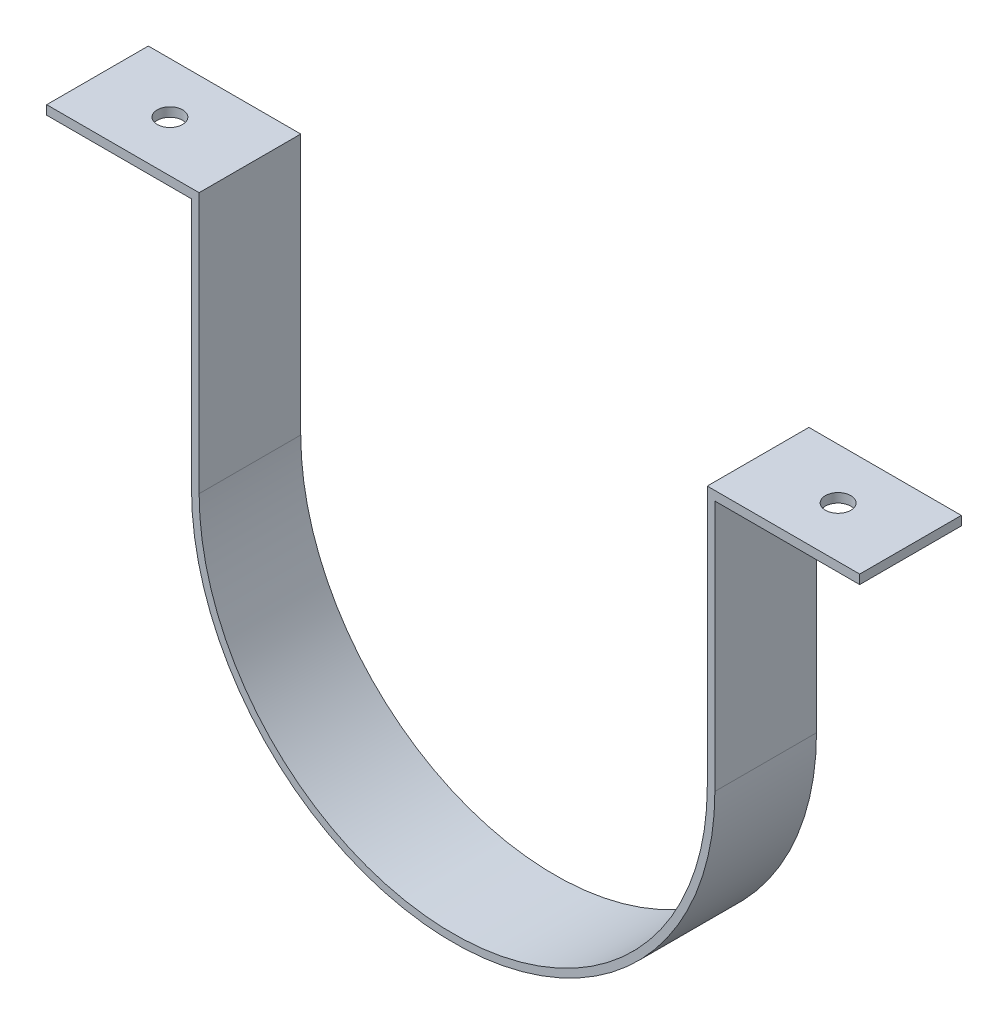
ISO-10303-21;
HEADER;
FILE_DESCRIPTION(('STEP AP214'),'2;1');
FILE_NAME('part.step','',(''),(''),'','','');
FILE_SCHEMA(('AUTOMOTIVE_DESIGN { 1 0 10303 214 1 1 1 1 }'));
ENDSEC;
DATA;
#1=APPLICATION_CONTEXT('core data for automotive mechanical design processes');
#2=APPLICATION_PROTOCOL_DEFINITION('international standard','automotive_design',2000,#1);
#3=PRODUCT_CONTEXT('',#1,'mechanical');
#4=PRODUCT('Part','Part','',(#3));
#5=PRODUCT_RELATED_PRODUCT_CATEGORY('part','',(#4));
#6=PRODUCT_DEFINITION_FORMATION('','',#4);
#7=PRODUCT_DEFINITION_CONTEXT('part definition',#1,'design');
#8=PRODUCT_DEFINITION('design','',#6,#7);
#9=PRODUCT_DEFINITION_SHAPE('','',#8);
#10=(LENGTH_UNIT() NAMED_UNIT(*) SI_UNIT(.MILLI.,.METRE.));
#11=(NAMED_UNIT(*) PLANE_ANGLE_UNIT() SI_UNIT($,.RADIAN.));
#12=(NAMED_UNIT(*) SI_UNIT($,.STERADIAN.) SOLID_ANGLE_UNIT());
#13=UNCERTAINTY_MEASURE_WITH_UNIT(LENGTH_MEASURE(1.E-05),#10,'distance_accuracy_value','');
#14=(GEOMETRIC_REPRESENTATION_CONTEXT(3) GLOBAL_UNCERTAINTY_ASSIGNED_CONTEXT((#13)) GLOBAL_UNIT_ASSIGNED_CONTEXT((#10,
#11,#12)) REPRESENTATION_CONTEXT('',''));
#15=CARTESIAN_POINT('',(0.,0.,0.));
#16=DIRECTION('',(0.,0.,1.));
#17=DIRECTION('',(1.,0.,0.));
#18=AXIS2_PLACEMENT_3D('',#15,#16,#17);
#19=CARTESIAN_POINT('',(91.5283724131082,0.,2.));
#20=DIRECTION('',(-1.,0.,0.));
#21=DIRECTION('',(0.,0.,1.));
#22=AXIS2_PLACEMENT_3D('',#19,#20,#21);
#23=PLANE('',#22);
#24=DIRECTION('',(0.,1.,0.));
#25=VECTOR('',#24,1.);
#26=CARTESIAN_POINT('',(91.5283724131082,0.,0.));
#27=LINE('',#26,#25);
#28=CARTESIAN_POINT('',(91.5283724131082,-7.72076374787895,0.));
#29=VERTEX_POINT('',#28);
#30=CARTESIAN_POINT('',(91.5283724131082,-2.77076374787895,0.));
#31=VERTEX_POINT('',#30);
#32=EDGE_CURVE('E154',#29,#31,#27,.T.);
#33=ORIENTED_EDGE('',*,*,#32,.F.);
#34=DIRECTION('',(0.,0.,-1.));
#35=VECTOR('',#34,1.);
#36=CARTESIAN_POINT('',(91.5283724131082,-7.72076374787895,2.));
#37=LINE('',#36,#35);
#38=CARTESIAN_POINT('',(91.5283724131082,-7.72076374787895,2.));
#39=VERTEX_POINT('',#38);
#40=EDGE_CURVE('E11',#39,#29,#37,.T.);
#41=ORIENTED_EDGE('',*,*,#40,.F.);
#42=DIRECTION('',(0.,1.,0.));
#43=VECTOR('',#42,1.);
#44=CARTESIAN_POINT('',(91.5283724131082,0.,2.));
#45=LINE('',#44,#43);
#46=CARTESIAN_POINT('',(91.5283724131082,-2.77076374787895,2.));
#47=VERTEX_POINT('',#46);
#48=EDGE_CURVE('E183',#39,#47,#45,.T.);
#49=ORIENTED_EDGE('',*,*,#48,.T.);
#50=DIRECTION('',(0.,0.,-1.));
#51=VECTOR('',#50,1.);
#52=CARTESIAN_POINT('',(91.5283724131082,-2.77076374787895,2.));
#53=LINE('',#52,#51);
#54=EDGE_CURVE('E52',#47,#31,#53,.T.);
#55=ORIENTED_EDGE('',*,*,#54,.T.);
#56=EDGE_LOOP('',(#33,#41,#49,#55));
#57=FACE_BOUND('',#56,.T.);
#58=ADVANCED_FACE('F35',(#57),#23,.T.);
#59=CARTESIAN_POINT('',(96.6783724131082,-7.72076374787895,2.));
#60=DIRECTION('',(0.,0.,-1.));
#61=DIRECTION('',(-1.,0.,0.));
#62=AXIS2_PLACEMENT_3D('',#59,#60,#61);
#63=CYLINDRICAL_SURFACE('',#62,5.15);
#64=CARTESIAN_POINT('',(96.6783724131082,-7.72076374787895,0.));
#65=DIRECTION('',(0.,0.,1.));
#66=DIRECTION('',(1.,0.,0.));
#67=AXIS2_PLACEMENT_3D('',#64,#65,#66);
#68=CIRCLE('',#67,5.15);
#69=CARTESIAN_POINT('',(101.828372413108,-7.72076374787895,0.));
#70=VERTEX_POINT('',#69);
#71=EDGE_CURVE('E156',#29,#70,#68,.T.);
#72=ORIENTED_EDGE('',*,*,#71,.T.);
#73=DIRECTION('',(0.,0.,-1.));
#74=VECTOR('',#73,1.);
#75=CARTESIAN_POINT('',(101.828372413108,-7.72076374787895,2.));
#76=LINE('',#75,#74);
#77=CARTESIAN_POINT('',(101.828372413108,-7.72076374787895,2.));
#78=VERTEX_POINT('',#77);
#79=EDGE_CURVE('E44',#78,#70,#76,.T.);
#80=ORIENTED_EDGE('',*,*,#79,.F.);
#81=CARTESIAN_POINT('',(96.6783724131082,-7.72076374787895,2.));
#82=DIRECTION('',(0.,0.,1.));
#83=DIRECTION('',(1.,0.,0.));
#84=AXIS2_PLACEMENT_3D('',#81,#82,#83);
#85=CIRCLE('',#84,5.15);
#86=EDGE_CURVE('E299',#39,#78,#85,.T.);
#87=ORIENTED_EDGE('',*,*,#86,.F.);
#88=ORIENTED_EDGE('',*,*,#40,.T.);
#89=EDGE_LOOP('',(#72,#80,#87,#88));
#90=FACE_BOUND('',#89,.T.);
#91=ADVANCED_FACE('F254',(#90),#63,.T.);
#92=CARTESIAN_POINT('',(101.828372413108,0.,2.));
#93=DIRECTION('',(-1.,0.,0.));
#94=DIRECTION('',(0.,0.,1.));
#95=AXIS2_PLACEMENT_3D('',#92,#93,#94);
#96=PLANE('',#95);
#97=DIRECTION('',(0.,1.,0.));
#98=VECTOR('',#97,1.);
#99=CARTESIAN_POINT('',(101.828372413108,0.,0.));
#100=LINE('',#99,#98);
#101=CARTESIAN_POINT('',(101.828372413108,-2.77076374787895,0.));
#102=VERTEX_POINT('',#101);
#103=EDGE_CURVE('E158',#70,#102,#100,.T.);
#104=ORIENTED_EDGE('',*,*,#103,.T.);
#105=DIRECTION('',(0.,0.,-1.));
#106=VECTOR('',#105,1.);
#107=CARTESIAN_POINT('',(101.828372413108,-2.77076374787895,2.));
#108=LINE('',#107,#106);
#109=CARTESIAN_POINT('',(101.828372413108,-2.77076374787895,2.));
#110=VERTEX_POINT('',#109);
#111=EDGE_CURVE('E198',#110,#102,#108,.T.);
#112=ORIENTED_EDGE('',*,*,#111,.F.);
#113=DIRECTION('',(0.,1.,0.));
#114=VECTOR('',#113,1.);
#115=CARTESIAN_POINT('',(101.828372413108,0.,2.));
#116=LINE('',#115,#114);
#117=EDGE_CURVE('E208',#78,#110,#116,.T.);
#118=ORIENTED_EDGE('',*,*,#117,.F.);
#119=ORIENTED_EDGE('',*,*,#79,.T.);
#120=EDGE_LOOP('',(#104,#112,#118,#119));
#121=FACE_BOUND('',#120,.T.);
#122=ADVANCED_FACE('F206',(#121),#96,.F.);
#123=CARTESIAN_POINT('',(0.,-2.77076374787895,2.));
#124=DIRECTION('',(0.,1.,0.));
#125=DIRECTION('',(0.,0.,1.));
#126=AXIS2_PLACEMENT_3D('',#123,#124,#125);
#127=PLANE('',#126);
#128=CARTESIAN_POINT('',(103.253372413108,-2.77076374787895,1.));
#129=DIRECTION('',(0.,-1.,0.));
#130=DIRECTION('',(0.,0.,-1.));
#131=AXIS2_PLACEMENT_3D('',#128,#129,#130);
#132=CIRCLE('',#131,0.25);
#133=CARTESIAN_POINT('',(103.253372413108,-2.77076374787895,0.750000000000001));
#134=VERTEX_POINT('',#133);
#135=EDGE_CURVE('E294',#134,#134,#132,.T.);
#136=ORIENTED_EDGE('',*,*,#135,.F.);
#137=EDGE_LOOP('',(#136));
#138=FACE_BOUND('',#137,.T.);
#139=DIRECTION('',(1.,0.,0.));
#140=VECTOR('',#139,1.);
#141=CARTESIAN_POINT('',(0.,-2.77076374787895,0.));
#142=LINE('',#141,#140);
#143=CARTESIAN_POINT('',(104.678372413108,-2.77076374787895,0.));
#144=VERTEX_POINT('',#143);
#145=EDGE_CURVE('E160',#102,#144,#142,.T.);
#146=ORIENTED_EDGE('',*,*,#145,.T.);
#147=DIRECTION('',(0.,0.,-1.));
#148=VECTOR('',#147,1.);
#149=CARTESIAN_POINT('',(104.678372413108,-2.77076374787895,2.));
#150=LINE('',#149,#148);
#151=CARTESIAN_POINT('',(104.678372413108,-2.77076374787895,2.));
#152=VERTEX_POINT('',#151);
#153=EDGE_CURVE('E195',#152,#144,#150,.T.);
#154=ORIENTED_EDGE('',*,*,#153,.F.);
#155=DIRECTION('',(1.,0.,0.));
#156=VECTOR('',#155,1.);
#157=CARTESIAN_POINT('',(0.,-2.77076374787895,2.));
#158=LINE('',#157,#156);
#159=EDGE_CURVE('E227',#110,#152,#158,.T.);
#160=ORIENTED_EDGE('',*,*,#159,.F.);
#161=ORIENTED_EDGE('',*,*,#111,.T.);
#162=EDGE_LOOP('',(#146,#154,#160,#161));
#163=FACE_BOUND('',#162,.T.);
#164=ADVANCED_FACE('F217',(#138,#163),#127,.F.);
#165=CARTESIAN_POINT('',(104.678372413108,0.,2.));
#166=DIRECTION('',(-1.,0.,0.));
#167=DIRECTION('',(0.,0.,1.));
#168=AXIS2_PLACEMENT_3D('',#165,#166,#167);
#169=PLANE('',#168);
#170=DIRECTION('',(0.,1.,0.));
#171=VECTOR('',#170,1.);
#172=CARTESIAN_POINT('',(104.678372413108,0.,0.));
#173=LINE('',#172,#171);
#174=CARTESIAN_POINT('',(104.678372413108,-2.59076374787895,0.));
#175=VERTEX_POINT('',#174);
#176=EDGE_CURVE('E162',#144,#175,#173,.T.);
#177=ORIENTED_EDGE('',*,*,#176,.T.);
#178=DIRECTION('',(0.,0.,-1.));
#179=VECTOR('',#178,1.);
#180=CARTESIAN_POINT('',(104.678372413108,-2.59076374787895,2.));
#181=LINE('',#180,#179);
#182=CARTESIAN_POINT('',(104.678372413108,-2.59076374787895,2.));
#183=VERTEX_POINT('',#182);
#184=EDGE_CURVE('E193',#183,#175,#181,.T.);
#185=ORIENTED_EDGE('',*,*,#184,.F.);
#186=DIRECTION('',(0.,1.,0.));
#187=VECTOR('',#186,1.);
#188=CARTESIAN_POINT('',(104.678372413108,0.,2.));
#189=LINE('',#188,#187);
#190=EDGE_CURVE('E223',#152,#183,#189,.T.);
#191=ORIENTED_EDGE('',*,*,#190,.F.);
#192=ORIENTED_EDGE('',*,*,#153,.T.);
#193=EDGE_LOOP('',(#177,#185,#191,#192));
#194=FACE_BOUND('',#193,.T.);
#195=ADVANCED_FACE('F221',(#194),#169,.F.);
#196=CARTESIAN_POINT('',(0.,-2.59076374787895,2.));
#197=DIRECTION('',(0.,1.,0.));
#198=DIRECTION('',(0.,0.,1.));
#199=AXIS2_PLACEMENT_3D('',#196,#197,#198);
#200=PLANE('',#199);
#201=CARTESIAN_POINT('',(103.253372413108,-2.59076374787895,1.));
#202=DIRECTION('',(0.,1.,0.));
#203=DIRECTION('',(0.,0.,1.));
#204=AXIS2_PLACEMENT_3D('',#201,#202,#203);
#205=CIRCLE('',#204,0.25);
#206=CARTESIAN_POINT('',(103.253372413108,-2.59076374787895,1.25));
#207=VERTEX_POINT('',#206);
#208=EDGE_CURVE('E38',#207,#207,#205,.T.);
#209=ORIENTED_EDGE('',*,*,#208,.F.);
#210=EDGE_LOOP('',(#209));
#211=FACE_BOUND('',#210,.T.);
#212=DIRECTION('',(1.,0.,0.));
#213=VECTOR('',#212,1.);
#214=CARTESIAN_POINT('',(0.,-2.59076374787895,0.));
#215=LINE('',#214,#213);
#216=CARTESIAN_POINT('',(101.678372413108,-2.59076374787895,0.));
#217=VERTEX_POINT('',#216);
#218=EDGE_CURVE('E165',#217,#175,#215,.T.);
#219=ORIENTED_EDGE('',*,*,#218,.F.);
#220=DIRECTION('',(0.,0.,-1.));
#221=VECTOR('',#220,1.);
#222=CARTESIAN_POINT('',(101.678372413108,-2.59076374787895,2.));
#223=LINE('',#222,#221);
#224=CARTESIAN_POINT('',(101.678372413108,-2.59076374787895,2.));
#225=VERTEX_POINT('',#224);
#226=EDGE_CURVE('E191',#225,#217,#223,.T.);
#227=ORIENTED_EDGE('',*,*,#226,.F.);
#228=DIRECTION('',(1.,0.,0.));
#229=VECTOR('',#228,1.);
#230=CARTESIAN_POINT('',(0.,-2.59076374787895,2.));
#231=LINE('',#230,#229);
#232=EDGE_CURVE('E226',#225,#183,#231,.T.);
#233=ORIENTED_EDGE('',*,*,#232,.T.);
#234=ORIENTED_EDGE('',*,*,#184,.T.);
#235=EDGE_LOOP('',(#219,#227,#233,#234));
#236=FACE_BOUND('',#235,.T.);
#237=ADVANCED_FACE('F268',(#211,#236),#200,.T.);
#238=CARTESIAN_POINT('',(101.678372413108,0.,2.));
#239=DIRECTION('',(1.,0.,0.));
#240=DIRECTION('',(0.,0.,-1.));
#241=AXIS2_PLACEMENT_3D('',#238,#239,#240);
#242=PLANE('',#241);
#243=DIRECTION('',(0.,-1.,0.));
#244=VECTOR('',#243,1.);
#245=CARTESIAN_POINT('',(101.678372413108,0.,0.));
#246=LINE('',#245,#244);
#247=CARTESIAN_POINT('',(101.678372413108,-7.72076374787895,0.));
#248=VERTEX_POINT('',#247);
#249=EDGE_CURVE('E168',#217,#248,#246,.T.);
#250=ORIENTED_EDGE('',*,*,#249,.T.);
#251=DIRECTION('',(0.,0.,-1.));
#252=VECTOR('',#251,1.);
#253=CARTESIAN_POINT('',(101.678372413108,-7.72076374787895,2.));
#254=LINE('',#253,#252);
#255=CARTESIAN_POINT('',(101.678372413108,-7.72076374787895,2.));
#256=VERTEX_POINT('',#255);
#257=EDGE_CURVE('E189',#256,#248,#254,.T.);
#258=ORIENTED_EDGE('',*,*,#257,.F.);
#259=DIRECTION('',(0.,-1.,0.));
#260=VECTOR('',#259,1.);
#261=CARTESIAN_POINT('',(101.678372413108,0.,2.));
#262=LINE('',#261,#260);
#263=EDGE_CURVE('E229',#225,#256,#262,.T.);
#264=ORIENTED_EDGE('',*,*,#263,.F.);
#265=ORIENTED_EDGE('',*,*,#226,.T.);
#266=EDGE_LOOP('',(#250,#258,#264,#265));
#267=FACE_BOUND('',#266,.T.);
#268=ADVANCED_FACE('F271',(#267),#242,.F.);
#269=CARTESIAN_POINT('',(96.6783724131082,-7.72076374787895,2.));
#270=DIRECTION('',(0.,0.,-1.));
#271=DIRECTION('',(-1.,0.,0.));
#272=AXIS2_PLACEMENT_3D('',#269,#270,#271);
#273=CYLINDRICAL_SURFACE('',#272,5.);
#274=CARTESIAN_POINT('',(96.6783724131082,-7.72076374787895,0.));
#275=DIRECTION('',(0.,0.,1.));
#276=DIRECTION('',(1.,0.,0.));
#277=AXIS2_PLACEMENT_3D('',#274,#275,#276);
#278=CIRCLE('',#277,5.);
#279=CARTESIAN_POINT('',(91.6783724131082,-7.72076374787895,0.));
#280=VERTEX_POINT('',#279);
#281=EDGE_CURVE('E171',#280,#248,#278,.T.);
#282=ORIENTED_EDGE('',*,*,#281,.F.);
#283=DIRECTION('',(0.,0.,-1.));
#284=VECTOR('',#283,1.);
#285=CARTESIAN_POINT('',(91.6783724131082,-7.72076374787895,2.));
#286=LINE('',#285,#284);
#287=CARTESIAN_POINT('',(91.6783724131082,-7.72076374787895,2.));
#288=VERTEX_POINT('',#287);
#289=EDGE_CURVE('E187',#288,#280,#286,.T.);
#290=ORIENTED_EDGE('',*,*,#289,.F.);
#291=CARTESIAN_POINT('',(96.6783724131082,-7.72076374787895,2.));
#292=DIRECTION('',(0.,0.,1.));
#293=DIRECTION('',(1.,0.,0.));
#294=AXIS2_PLACEMENT_3D('',#291,#292,#293);
#295=CIRCLE('',#294,5.);
#296=EDGE_CURVE('E235',#288,#256,#295,.T.);
#297=ORIENTED_EDGE('',*,*,#296,.T.);
#298=ORIENTED_EDGE('',*,*,#257,.T.);
#299=EDGE_LOOP('',(#282,#290,#297,#298));
#300=FACE_BOUND('',#299,.T.);
#301=ADVANCED_FACE('F275',(#300),#273,.F.);
#302=CARTESIAN_POINT('',(91.6783724131082,0.,2.));
#303=DIRECTION('',(1.,0.,0.));
#304=DIRECTION('',(0.,0.,-1.));
#305=AXIS2_PLACEMENT_3D('',#302,#303,#304);
#306=PLANE('',#305);
#307=DIRECTION('',(0.,-1.,0.));
#308=VECTOR('',#307,1.);
#309=CARTESIAN_POINT('',(91.6783724131082,0.,0.));
#310=LINE('',#309,#308);
#311=CARTESIAN_POINT('',(91.6783724131082,-2.59076374787895,0.));
#312=VERTEX_POINT('',#311);
#313=EDGE_CURVE('E174',#312,#280,#310,.T.);
#314=ORIENTED_EDGE('',*,*,#313,.F.);
#315=DIRECTION('',(0.,0.,-1.));
#316=VECTOR('',#315,1.);
#317=CARTESIAN_POINT('',(91.6783724131082,-2.59076374787895,2.));
#318=LINE('',#317,#316);
#319=CARTESIAN_POINT('',(91.6783724131082,-2.59076374787895,2.));
#320=VERTEX_POINT('',#319);
#321=EDGE_CURVE('E146',#320,#312,#318,.T.);
#322=ORIENTED_EDGE('',*,*,#321,.F.);
#323=DIRECTION('',(0.,-1.,0.));
#324=VECTOR('',#323,1.);
#325=CARTESIAN_POINT('',(91.6783724131082,0.,2.));
#326=LINE('',#325,#324);
#327=EDGE_CURVE('E136',#320,#288,#326,.T.);
#328=ORIENTED_EDGE('',*,*,#327,.T.);
#329=ORIENTED_EDGE('',*,*,#289,.T.);
#330=EDGE_LOOP('',(#314,#322,#328,#329));
#331=FACE_BOUND('',#330,.T.);
#332=ADVANCED_FACE('F239',(#331),#306,.T.);
#333=CARTESIAN_POINT('',(0.,-2.59076374787895,2.));
#334=DIRECTION('',(0.,-1.,0.));
#335=DIRECTION('',(0.,0.,-1.));
#336=AXIS2_PLACEMENT_3D('',#333,#334,#335);
#337=PLANE('',#336);
#338=CARTESIAN_POINT('',(90.1033724131082,-2.59076374787895,1.));
#339=DIRECTION('',(0.,-1.,0.));
#340=DIRECTION('',(0.,0.,-1.));
#341=AXIS2_PLACEMENT_3D('',#338,#339,#340);
#342=CIRCLE('',#341,0.25);
#343=CARTESIAN_POINT('',(90.1033724131082,-2.59076374787895,0.750000000000001));
#344=VERTEX_POINT('',#343);
#345=EDGE_CURVE('E288',#344,#344,#342,.T.);
#346=ORIENTED_EDGE('',*,*,#345,.T.);
#347=EDGE_LOOP('',(#346));
#348=FACE_BOUND('',#347,.T.);
#349=DIRECTION('',(-1.,0.,0.));
#350=VECTOR('',#349,1.);
#351=CARTESIAN_POINT('',(0.,-2.59076374787895,0.));
#352=LINE('',#351,#350);
#353=CARTESIAN_POINT('',(88.6783724131082,-2.59076374787895,0.));
#354=VERTEX_POINT('',#353);
#355=EDGE_CURVE('E143',#312,#354,#352,.T.);
#356=ORIENTED_EDGE('',*,*,#355,.T.);
#357=DIRECTION('',(0.,0.,-1.));
#358=VECTOR('',#357,1.);
#359=CARTESIAN_POINT('',(88.6783724131082,-2.59076374787895,2.));
#360=LINE('',#359,#358);
#361=CARTESIAN_POINT('',(88.6783724131082,-2.59076374787895,2.));
#362=VERTEX_POINT('',#361);
#363=EDGE_CURVE('E140',#362,#354,#360,.T.);
#364=ORIENTED_EDGE('',*,*,#363,.F.);
#365=DIRECTION('',(-1.,0.,0.));
#366=VECTOR('',#365,1.);
#367=CARTESIAN_POINT('',(0.,-2.59076374787895,2.));
#368=LINE('',#367,#366);
#369=EDGE_CURVE('E127',#320,#362,#368,.T.);
#370=ORIENTED_EDGE('',*,*,#369,.F.);
#371=ORIENTED_EDGE('',*,*,#321,.T.);
#372=EDGE_LOOP('',(#356,#364,#370,#371));
#373=FACE_BOUND('',#372,.T.);
#374=ADVANCED_FACE('F141',(#348,#373),#337,.F.);
#375=CARTESIAN_POINT('',(88.6783724131082,0.,2.));
#376=DIRECTION('',(-1.,0.,0.));
#377=DIRECTION('',(0.,0.,1.));
#378=AXIS2_PLACEMENT_3D('',#375,#376,#377);
#379=PLANE('',#378);
#380=DIRECTION('',(0.,1.,0.));
#381=VECTOR('',#380,1.);
#382=CARTESIAN_POINT('',(88.6783724131082,0.,0.));
#383=LINE('',#382,#381);
#384=CARTESIAN_POINT('',(88.6783724131082,-2.77076374787895,0.));
#385=VERTEX_POINT('',#384);
#386=EDGE_CURVE('E178',#385,#354,#383,.T.);
#387=ORIENTED_EDGE('',*,*,#386,.F.);
#388=DIRECTION('',(0.,0.,-1.));
#389=VECTOR('',#388,1.);
#390=CARTESIAN_POINT('',(88.6783724131082,-2.77076374787895,2.));
#391=LINE('',#390,#389);
#392=CARTESIAN_POINT('',(88.6783724131082,-2.77076374787895,2.));
#393=VERTEX_POINT('',#392);
#394=EDGE_CURVE('E89',#393,#385,#391,.T.);
#395=ORIENTED_EDGE('',*,*,#394,.F.);
#396=DIRECTION('',(0.,1.,0.));
#397=VECTOR('',#396,1.);
#398=CARTESIAN_POINT('',(88.6783724131082,0.,2.));
#399=LINE('',#398,#397);
#400=EDGE_CURVE('E133',#393,#362,#399,.T.);
#401=ORIENTED_EDGE('',*,*,#400,.T.);
#402=ORIENTED_EDGE('',*,*,#363,.T.);
#403=EDGE_LOOP('',(#387,#395,#401,#402));
#404=FACE_BOUND('',#403,.T.);
#405=ADVANCED_FACE('F148',(#404),#379,.T.);
#406=CARTESIAN_POINT('',(0.,-2.77076374787895,2.));
#407=DIRECTION('',(0.,-1.,0.));
#408=DIRECTION('',(0.,0.,-1.));
#409=AXIS2_PLACEMENT_3D('',#406,#407,#408);
#410=PLANE('',#409);
#411=CARTESIAN_POINT('',(90.1033724131082,-2.77076374787895,1.));
#412=DIRECTION('',(0.,-1.,0.));
#413=DIRECTION('',(0.,0.,-1.));
#414=AXIS2_PLACEMENT_3D('',#411,#412,#413);
#415=CIRCLE('',#414,0.25);
#416=CARTESIAN_POINT('',(90.1033724131082,-2.77076374787895,0.750000000000001));
#417=VERTEX_POINT('',#416);
#418=EDGE_CURVE('E290',#417,#417,#415,.T.);
#419=ORIENTED_EDGE('',*,*,#418,.F.);
#420=EDGE_LOOP('',(#419));
#421=FACE_BOUND('',#420,.T.);
#422=DIRECTION('',(-1.,0.,0.));
#423=VECTOR('',#422,1.);
#424=CARTESIAN_POINT('',(0.,-2.77076374787895,0.));
#425=LINE('',#424,#423);
#426=EDGE_CURVE('E180',#31,#385,#425,.T.);
#427=ORIENTED_EDGE('',*,*,#426,.F.);
#428=ORIENTED_EDGE('',*,*,#54,.F.);
#429=DIRECTION('',(-1.,0.,0.));
#430=VECTOR('',#429,1.);
#431=CARTESIAN_POINT('',(0.,-2.77076374787895,2.));
#432=LINE('',#431,#430);
#433=EDGE_CURVE('E149',#47,#393,#432,.T.);
#434=ORIENTED_EDGE('',*,*,#433,.T.);
#435=ORIENTED_EDGE('',*,*,#394,.T.);
#436=EDGE_LOOP('',(#427,#428,#434,#435));
#437=FACE_BOUND('',#436,.T.);
#438=ADVANCED_FACE('F241',(#421,#437),#410,.T.);
#439=CARTESIAN_POINT('',(0.,0.,2.));
#440=DIRECTION('',(0.,0.,1.));
#441=DIRECTION('',(1.,0.,0.));
#442=AXIS2_PLACEMENT_3D('',#439,#440,#441);
#443=PLANE('',#442);
#444=ORIENTED_EDGE('',*,*,#48,.F.);
#445=ORIENTED_EDGE('',*,*,#86,.T.);
#446=ORIENTED_EDGE('',*,*,#117,.T.);
#447=ORIENTED_EDGE('',*,*,#159,.T.);
#448=ORIENTED_EDGE('',*,*,#190,.T.);
#449=ORIENTED_EDGE('',*,*,#232,.F.);
#450=ORIENTED_EDGE('',*,*,#263,.T.);
#451=ORIENTED_EDGE('',*,*,#296,.F.);
#452=ORIENTED_EDGE('',*,*,#327,.F.);
#453=ORIENTED_EDGE('',*,*,#369,.T.);
#454=ORIENTED_EDGE('',*,*,#400,.F.);
#455=ORIENTED_EDGE('',*,*,#433,.F.);
#456=EDGE_LOOP('',(#444,#445,#446,#447,#448,#449,#450,#451,#452,#453,#454,#455));
#457=FACE_BOUND('',#456,.T.);
#458=ADVANCED_FACE('F130',(#457),#443,.T.);
#459=CARTESIAN_POINT('',(0.,0.,0.));
#460=DIRECTION('',(0.,0.,1.));
#461=DIRECTION('',(1.,0.,0.));
#462=AXIS2_PLACEMENT_3D('',#459,#460,#461);
#463=PLANE('',#462);
#464=ORIENTED_EDGE('',*,*,#32,.T.);
#465=ORIENTED_EDGE('',*,*,#426,.T.);
#466=ORIENTED_EDGE('',*,*,#386,.T.);
#467=ORIENTED_EDGE('',*,*,#355,.F.);
#468=ORIENTED_EDGE('',*,*,#313,.T.);
#469=ORIENTED_EDGE('',*,*,#281,.T.);
#470=ORIENTED_EDGE('',*,*,#249,.F.);
#471=ORIENTED_EDGE('',*,*,#218,.T.);
#472=ORIENTED_EDGE('',*,*,#176,.F.);
#473=ORIENTED_EDGE('',*,*,#145,.F.);
#474=ORIENTED_EDGE('',*,*,#103,.F.);
#475=ORIENTED_EDGE('',*,*,#71,.F.);
#476=EDGE_LOOP('',(#464,#465,#466,#467,#468,#469,#470,#471,#472,#473,#474,#475));
#477=FACE_BOUND('',#476,.T.);
#478=ADVANCED_FACE('F213',(#477),#463,.F.);
#479=CARTESIAN_POINT('',(90.1033724131082,-0.770763747878952,1.));
#480=DIRECTION('',(0.,-1.,0.));
#481=DIRECTION('',(0.,0.,-1.));
#482=AXIS2_PLACEMENT_3D('',#479,#480,#481);
#483=CYLINDRICAL_SURFACE('',#482,0.25);
#484=ORIENTED_EDGE('',*,*,#418,.T.);
#485=EDGE_LOOP('',(#484));
#486=FACE_BOUND('',#485,.T.);
#487=ORIENTED_EDGE('',*,*,#345,.F.);
#488=EDGE_LOOP('',(#487));
#489=FACE_BOUND('',#488,.T.);
#490=ADVANCED_FACE('F305',(#486,#489),#483,.F.);
#491=CARTESIAN_POINT('',(103.253372413108,-0.770763747878952,1.));
#492=DIRECTION('',(0.,-1.,0.));
#493=DIRECTION('',(0.,0.,-1.));
#494=AXIS2_PLACEMENT_3D('',#491,#492,#493);
#495=CYLINDRICAL_SURFACE('',#494,0.25);
#496=ORIENTED_EDGE('',*,*,#208,.T.);
#497=EDGE_LOOP('',(#496));
#498=FACE_BOUND('',#497,.T.);
#499=ORIENTED_EDGE('',*,*,#135,.T.);
#500=EDGE_LOOP('',(#499));
#501=FACE_BOUND('',#500,.T.);
#502=ADVANCED_FACE('F303',(#498,#501),#495,.F.);
#503=CLOSED_SHELL('',(#58,#91,#122,#164,#195,#237,#268,#301,#332,#374,#405,#438,#458,#478,#490,#502));
#504=MANIFOLD_SOLID_BREP('B2',#503);
#505=ADVANCED_BREP_SHAPE_REPRESENTATION('',(#18,#504),#14);
#506=SHAPE_DEFINITION_REPRESENTATION(#9,#505);
ENDSEC;
END-ISO-10303-21;
